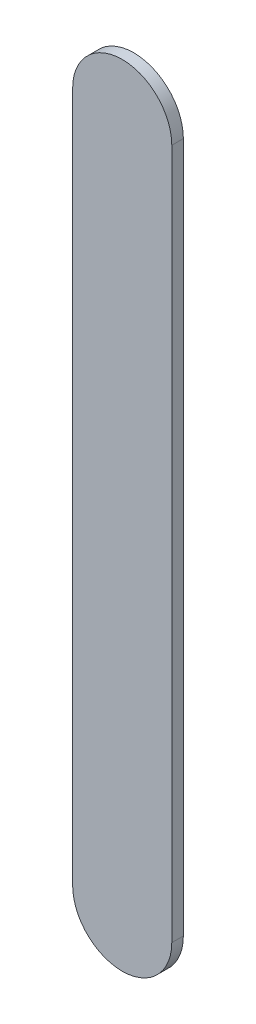
ISO-10303-21;
HEADER;
FILE_DESCRIPTION(('STEP AP214'),'2;1');
FILE_NAME('part.step','',(''),(''),'','','');
FILE_SCHEMA(('AUTOMOTIVE_DESIGN { 1 0 10303 214 1 1 1 1 }'));
ENDSEC;
DATA;
#1=APPLICATION_CONTEXT('core data for automotive mechanical design processes');
#2=APPLICATION_PROTOCOL_DEFINITION('international standard','automotive_design',2000,#1);
#3=PRODUCT_CONTEXT('',#1,'mechanical');
#4=PRODUCT('Part','Part','',(#3));
#5=PRODUCT_RELATED_PRODUCT_CATEGORY('part','',(#4));
#6=PRODUCT_DEFINITION_FORMATION('','',#4);
#7=PRODUCT_DEFINITION_CONTEXT('part definition',#1,'design');
#8=PRODUCT_DEFINITION('design','',#6,#7);
#9=PRODUCT_DEFINITION_SHAPE('','',#8);
#10=(LENGTH_UNIT() NAMED_UNIT(*) SI_UNIT(.MILLI.,.METRE.));
#11=(NAMED_UNIT(*) PLANE_ANGLE_UNIT() SI_UNIT($,.RADIAN.));
#12=(NAMED_UNIT(*) SI_UNIT($,.STERADIAN.) SOLID_ANGLE_UNIT());
#13=UNCERTAINTY_MEASURE_WITH_UNIT(LENGTH_MEASURE(1.E-05),#10,'distance_accuracy_value','');
#14=(GEOMETRIC_REPRESENTATION_CONTEXT(3) GLOBAL_UNCERTAINTY_ASSIGNED_CONTEXT((#13)) GLOBAL_UNIT_ASSIGNED_CONTEXT((#10,
#11,#12)) REPRESENTATION_CONTEXT('',''));
#15=CARTESIAN_POINT('',(0.,0.,0.));
#16=DIRECTION('',(0.,0.,1.));
#17=DIRECTION('',(1.,0.,0.));
#18=AXIS2_PLACEMENT_3D('',#15,#16,#17);
#19=CARTESIAN_POINT('',(92.94,-135.01,1.635));
#20=DIRECTION('',(0.,0.,1.));
#21=DIRECTION('',(1.,0.,0.));
#22=AXIS2_PLACEMENT_3D('',#19,#20,#21);
#23=PLANE('',#22);
#24=DIRECTION('',(0.,-1.,0.));
#25=VECTOR('',#24,1.);
#26=CARTESIAN_POINT('',(92.94,-135.01,1.635));
#27=LINE('',#26,#25);
#28=CARTESIAN_POINT('',(92.94,-135.01,1.635));
#29=VERTEX_POINT('',#28);
#30=CARTESIAN_POINT('',(92.94,-137.1,1.635));
#31=VERTEX_POINT('',#30);
#32=EDGE_CURVE('E85',#29,#31,#27,.T.);
#33=ORIENTED_EDGE('',*,*,#32,.T.);
#34=CARTESIAN_POINT('',(93.09,-137.1,1.635));
#35=DIRECTION('',(0.,0.,1.));
#36=DIRECTION('',(-1.,1.894780628694E-13,0.));
#37=AXIS2_PLACEMENT_3D('',#34,#35,#36);
#38=CIRCLE('',#37,0.15);
#39=CARTESIAN_POINT('',(93.24,-137.1,1.635));
#40=VERTEX_POINT('',#39);
#41=EDGE_CURVE('E109',#31,#40,#38,.T.);
#42=ORIENTED_EDGE('',*,*,#41,.T.);
#43=DIRECTION('',(0.,1.,0.));
#44=VECTOR('',#43,1.);
#45=CARTESIAN_POINT('',(93.24,-137.1,1.635));
#46=LINE('',#45,#44);
#47=CARTESIAN_POINT('',(93.24,-135.01,1.635));
#48=VERTEX_POINT('',#47);
#49=EDGE_CURVE('E77',#40,#48,#46,.T.);
#50=ORIENTED_EDGE('',*,*,#49,.T.);
#51=CARTESIAN_POINT('',(93.09,-135.01,1.635));
#52=DIRECTION('',(0.,0.,1.));
#53=DIRECTION('',(1.,1.894780628694E-13,0.));
#54=AXIS2_PLACEMENT_3D('',#51,#52,#53);
#55=CIRCLE('',#54,0.15);
#56=EDGE_CURVE('E11',#48,#29,#55,.T.);
#57=ORIENTED_EDGE('',*,*,#56,.T.);
#58=EDGE_LOOP('',(#33,#42,#50,#57));
#59=FACE_BOUND('',#58,.T.);
#60=ADVANCED_FACE('F17',(#59),#23,.T.);
#61=CARTESIAN_POINT('',(92.94,-135.01,1.6));
#62=DIRECTION('',(0.,0.,1.));
#63=DIRECTION('',(1.,0.,0.));
#64=AXIS2_PLACEMENT_3D('',#61,#62,#63);
#65=PLANE('',#64);
#66=CARTESIAN_POINT('',(93.09,-135.01,1.6));
#67=DIRECTION('',(0.,0.,1.));
#68=DIRECTION('',(1.,1.894780628694E-13,0.));
#69=AXIS2_PLACEMENT_3D('',#66,#67,#68);
#70=CIRCLE('',#69,0.15);
#71=CARTESIAN_POINT('',(93.24,-135.01,1.6));
#72=VERTEX_POINT('',#71);
#73=CARTESIAN_POINT('',(92.94,-135.01,1.6));
#74=VERTEX_POINT('',#73);
#75=EDGE_CURVE('E27',#72,#74,#70,.T.);
#76=ORIENTED_EDGE('',*,*,#75,.F.);
#77=DIRECTION('',(0.,1.,0.));
#78=VECTOR('',#77,1.);
#79=CARTESIAN_POINT('',(93.24,-137.1,1.6));
#80=LINE('',#79,#78);
#81=CARTESIAN_POINT('',(93.24,-137.1,1.6));
#82=VERTEX_POINT('',#81);
#83=EDGE_CURVE('E21',#82,#72,#80,.T.);
#84=ORIENTED_EDGE('',*,*,#83,.F.);
#85=CARTESIAN_POINT('',(93.09,-137.1,1.6));
#86=DIRECTION('',(0.,0.,1.));
#87=DIRECTION('',(-1.,1.894780628694E-13,0.));
#88=AXIS2_PLACEMENT_3D('',#85,#86,#87);
#89=CIRCLE('',#88,0.15);
#90=CARTESIAN_POINT('',(92.94,-137.1,1.6));
#91=VERTEX_POINT('',#90);
#92=EDGE_CURVE('E87',#91,#82,#89,.T.);
#93=ORIENTED_EDGE('',*,*,#92,.F.);
#94=DIRECTION('',(0.,-1.,0.));
#95=VECTOR('',#94,1.);
#96=CARTESIAN_POINT('',(92.94,-135.01,1.6));
#97=LINE('',#96,#95);
#98=EDGE_CURVE('E83',#74,#91,#97,.T.);
#99=ORIENTED_EDGE('',*,*,#98,.F.);
#100=EDGE_LOOP('',(#76,#84,#93,#99));
#101=FACE_BOUND('',#100,.T.);
#102=ADVANCED_FACE('F19',(#101),#65,.F.);
#103=CARTESIAN_POINT('',(93.09,-135.01,1.6));
#104=DIRECTION('',(0.,0.,-1.));
#105=DIRECTION('',(1.,1.894780628694E-13,0.));
#106=AXIS2_PLACEMENT_3D('',#103,#104,#105);
#107=CYLINDRICAL_SURFACE('',#106,0.15);
#108=ORIENTED_EDGE('',*,*,#75,.T.);
#109=DIRECTION('',(0.,0.,1.));
#110=VECTOR('',#109,1.);
#111=CARTESIAN_POINT('',(92.94,-135.01,1.6));
#112=LINE('',#111,#110);
#113=EDGE_CURVE('E71',#74,#29,#112,.T.);
#114=ORIENTED_EDGE('',*,*,#113,.T.);
#115=ORIENTED_EDGE('',*,*,#56,.F.);
#116=DIRECTION('',(0.,0.,1.));
#117=VECTOR('',#116,1.);
#118=CARTESIAN_POINT('',(93.24,-135.01,1.6));
#119=LINE('',#118,#117);
#120=EDGE_CURVE('E74',#72,#48,#119,.T.);
#121=ORIENTED_EDGE('',*,*,#120,.F.);
#122=EDGE_LOOP('',(#108,#114,#115,#121));
#123=FACE_BOUND('',#122,.T.);
#124=ADVANCED_FACE('F70',(#123),#107,.T.);
#125=CARTESIAN_POINT('',(93.24,-137.1,1.6));
#126=DIRECTION('',(-1.,0.,0.));
#127=DIRECTION('',(0.,0.,1.));
#128=AXIS2_PLACEMENT_3D('',#125,#126,#127);
#129=PLANE('',#128);
#130=ORIENTED_EDGE('',*,*,#83,.T.);
#131=ORIENTED_EDGE('',*,*,#120,.T.);
#132=ORIENTED_EDGE('',*,*,#49,.F.);
#133=DIRECTION('',(0.,0.,1.));
#134=VECTOR('',#133,1.);
#135=CARTESIAN_POINT('',(93.24,-137.1,1.6));
#136=LINE('',#135,#134);
#137=EDGE_CURVE('E105',#82,#40,#136,.T.);
#138=ORIENTED_EDGE('',*,*,#137,.F.);
#139=EDGE_LOOP('',(#130,#131,#132,#138));
#140=FACE_BOUND('',#139,.T.);
#141=ADVANCED_FACE('F121',(#140),#129,.F.);
#142=CARTESIAN_POINT('',(93.09,-137.1,1.6));
#143=DIRECTION('',(0.,0.,-1.));
#144=DIRECTION('',(-1.,1.894780628694E-13,0.));
#145=AXIS2_PLACEMENT_3D('',#142,#143,#144);
#146=CYLINDRICAL_SURFACE('',#145,0.15);
#147=ORIENTED_EDGE('',*,*,#92,.T.);
#148=ORIENTED_EDGE('',*,*,#137,.T.);
#149=ORIENTED_EDGE('',*,*,#41,.F.);
#150=DIRECTION('',(0.,0.,1.));
#151=VECTOR('',#150,1.);
#152=CARTESIAN_POINT('',(92.94,-137.1,1.6));
#153=LINE('',#152,#151);
#154=EDGE_CURVE('E92',#91,#31,#153,.T.);
#155=ORIENTED_EDGE('',*,*,#154,.F.);
#156=EDGE_LOOP('',(#147,#148,#149,#155));
#157=FACE_BOUND('',#156,.T.);
#158=ADVANCED_FACE('F123',(#157),#146,.T.);
#159=CARTESIAN_POINT('',(92.94,-135.01,1.6));
#160=DIRECTION('',(1.,0.,0.));
#161=DIRECTION('',(0.,1.,0.));
#162=AXIS2_PLACEMENT_3D('',#159,#160,#161);
#163=PLANE('',#162);
#164=ORIENTED_EDGE('',*,*,#98,.T.);
#165=ORIENTED_EDGE('',*,*,#154,.T.);
#166=ORIENTED_EDGE('',*,*,#32,.F.);
#167=ORIENTED_EDGE('',*,*,#113,.F.);
#168=EDGE_LOOP('',(#164,#165,#166,#167));
#169=FACE_BOUND('',#168,.T.);
#170=ADVANCED_FACE('F81',(#169),#163,.F.);
#171=CLOSED_SHELL('',(#60,#102,#124,#141,#158,#170));
#172=MANIFOLD_SOLID_BREP('B1',#171);
#173=ADVANCED_BREP_SHAPE_REPRESENTATION('',(#18,#172),#14);
#174=SHAPE_DEFINITION_REPRESENTATION(#9,#173);
ENDSEC;
END-ISO-10303-21;
